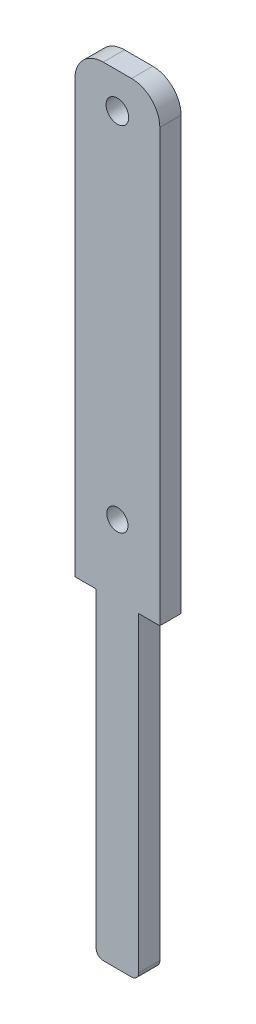
ISO-10303-21;
HEADER;
FILE_DESCRIPTION(('STEP AP214'),'2;1');
FILE_NAME('part.step','',(''),(''),'','','');
FILE_SCHEMA(('AUTOMOTIVE_DESIGN { 1 0 10303 214 1 1 1 1 }'));
ENDSEC;
DATA;
#1=APPLICATION_CONTEXT('core data for automotive mechanical design processes');
#2=APPLICATION_PROTOCOL_DEFINITION('international standard','automotive_design',2000,#1);
#3=PRODUCT_CONTEXT('',#1,'mechanical');
#4=PRODUCT('Part','Part','',(#3));
#5=PRODUCT_RELATED_PRODUCT_CATEGORY('part','',(#4));
#6=PRODUCT_DEFINITION_FORMATION('','',#4);
#7=PRODUCT_DEFINITION_CONTEXT('part definition',#1,'design');
#8=PRODUCT_DEFINITION('design','',#6,#7);
#9=PRODUCT_DEFINITION_SHAPE('','',#8);
#10=(LENGTH_UNIT() NAMED_UNIT(*) SI_UNIT(.MILLI.,.METRE.));
#11=(NAMED_UNIT(*) PLANE_ANGLE_UNIT() SI_UNIT($,.RADIAN.));
#12=(NAMED_UNIT(*) SI_UNIT($,.STERADIAN.) SOLID_ANGLE_UNIT());
#13=UNCERTAINTY_MEASURE_WITH_UNIT(LENGTH_MEASURE(1.E-05),#10,'distance_accuracy_value','');
#14=(GEOMETRIC_REPRESENTATION_CONTEXT(3) GLOBAL_UNCERTAINTY_ASSIGNED_CONTEXT((#13)) GLOBAL_UNIT_ASSIGNED_CONTEXT((#10,
#11,#12)) REPRESENTATION_CONTEXT('',''));
#15=CARTESIAN_POINT('',(0.,0.,0.));
#16=DIRECTION('',(0.,0.,1.));
#17=DIRECTION('',(1.,0.,0.));
#18=AXIS2_PLACEMENT_3D('',#15,#16,#17);
#19=CARTESIAN_POINT('',(-2.,51.,1.5));
#20=DIRECTION('',(0.,0.,-1.));
#21=DIRECTION('',(-1.,0.,0.));
#22=AXIS2_PLACEMENT_3D('',#19,#20,#21);
#23=CYLINDRICAL_SURFACE('',#22,4.);
#24=CARTESIAN_POINT('',(-2.,51.,-1.5));
#25=DIRECTION('',(0.,0.,1.));
#26=DIRECTION('',(1.,0.,0.));
#27=AXIS2_PLACEMENT_3D('',#24,#25,#26);
#28=CIRCLE('',#27,4.);
#29=CARTESIAN_POINT('',(-6.,51.,-1.5));
#30=VERTEX_POINT('',#29);
#31=CARTESIAN_POINT('',(-2.,55.,-1.5));
#32=VERTEX_POINT('',#31);
#33=EDGE_CURVE('E135',#30,#32,#28,.F.);
#34=ORIENTED_EDGE('',*,*,#33,.F.);
#35=DIRECTION('',(0.,0.,-1.));
#36=VECTOR('',#35,1.);
#37=CARTESIAN_POINT('',(-6.,51.,1.5));
#38=LINE('',#37,#36);
#39=CARTESIAN_POINT('',(-6.,51.,1.5));
#40=VERTEX_POINT('',#39);
#41=EDGE_CURVE('E130',#40,#30,#38,.T.);
#42=ORIENTED_EDGE('',*,*,#41,.F.);
#43=CARTESIAN_POINT('',(-2.,51.,1.5));
#44=DIRECTION('',(0.,0.,1.));
#45=DIRECTION('',(1.,0.,0.));
#46=AXIS2_PLACEMENT_3D('',#43,#44,#45);
#47=CIRCLE('',#46,4.);
#48=CARTESIAN_POINT('',(-2.,55.,1.5));
#49=VERTEX_POINT('',#48);
#50=EDGE_CURVE('E132',#40,#49,#47,.F.);
#51=ORIENTED_EDGE('',*,*,#50,.T.);
#52=DIRECTION('',(0.,0.,-1.));
#53=VECTOR('',#52,1.);
#54=CARTESIAN_POINT('',(-2.,55.,1.5));
#55=LINE('',#54,#53);
#56=EDGE_CURVE('E173',#49,#32,#55,.T.);
#57=ORIENTED_EDGE('',*,*,#56,.T.);
#58=EDGE_LOOP('',(#34,#42,#51,#57));
#59=FACE_BOUND('',#58,.T.);
#60=ADVANCED_FACE('F38',(#59),#23,.T.);
#61=CARTESIAN_POINT('',(-6.,0.,1.5));
#62=DIRECTION('',(-1.,0.,0.));
#63=DIRECTION('',(0.,-1.,0.));
#64=AXIS2_PLACEMENT_3D('',#61,#62,#63);
#65=PLANE('',#64);
#66=DIRECTION('',(0.,1.,0.));
#67=VECTOR('',#66,1.);
#68=CARTESIAN_POINT('',(-6.,0.,-1.5));
#69=LINE('',#68,#67);
#70=CARTESIAN_POINT('',(-6.,-10.,-1.5));
#71=VERTEX_POINT('',#70);
#72=EDGE_CURVE('E175',#71,#30,#69,.T.);
#73=ORIENTED_EDGE('',*,*,#72,.F.);
#74=DIRECTION('',(0.,0.,-1.));
#75=VECTOR('',#74,1.);
#76=CARTESIAN_POINT('',(-6.,-10.,1.5));
#77=LINE('',#76,#75);
#78=CARTESIAN_POINT('',(-6.,-10.,1.5));
#79=VERTEX_POINT('',#78);
#80=EDGE_CURVE('E141',#79,#71,#77,.T.);
#81=ORIENTED_EDGE('',*,*,#80,.F.);
#82=DIRECTION('',(0.,1.,0.));
#83=VECTOR('',#82,1.);
#84=CARTESIAN_POINT('',(-6.,0.,1.5));
#85=LINE('',#84,#83);
#86=EDGE_CURVE('E146',#79,#40,#85,.T.);
#87=ORIENTED_EDGE('',*,*,#86,.T.);
#88=ORIENTED_EDGE('',*,*,#41,.T.);
#89=EDGE_LOOP('',(#73,#81,#87,#88));
#90=FACE_BOUND('',#89,.T.);
#91=ADVANCED_FACE('F152',(#90),#65,.T.);
#92=CARTESIAN_POINT('',(0.,-10.,1.5));
#93=DIRECTION('',(0.,1.,0.));
#94=DIRECTION('',(0.,0.,1.));
#95=AXIS2_PLACEMENT_3D('',#92,#93,#94);
#96=PLANE('',#95);
#97=DIRECTION('',(1.,0.,0.));
#98=VECTOR('',#97,1.);
#99=CARTESIAN_POINT('',(0.,-10.,-1.5));
#100=LINE('',#99,#98);
#101=CARTESIAN_POINT('',(-3.,-10.,-1.5));
#102=VERTEX_POINT('',#101);
#103=EDGE_CURVE('E178',#71,#102,#100,.T.);
#104=ORIENTED_EDGE('',*,*,#103,.T.);
#105=DIRECTION('',(0.,0.,-1.));
#106=VECTOR('',#105,1.);
#107=CARTESIAN_POINT('',(-3.,-10.,1.5));
#108=LINE('',#107,#106);
#109=CARTESIAN_POINT('',(-3.,-10.,1.5));
#110=VERTEX_POINT('',#109);
#111=EDGE_CURVE('E207',#110,#102,#108,.T.);
#112=ORIENTED_EDGE('',*,*,#111,.F.);
#113=DIRECTION('',(1.,0.,0.));
#114=VECTOR('',#113,1.);
#115=CARTESIAN_POINT('',(0.,-10.,1.5));
#116=LINE('',#115,#114);
#117=EDGE_CURVE('E154',#79,#110,#116,.T.);
#118=ORIENTED_EDGE('',*,*,#117,.F.);
#119=ORIENTED_EDGE('',*,*,#80,.T.);
#120=EDGE_LOOP('',(#104,#112,#118,#119));
#121=FACE_BOUND('',#120,.T.);
#122=ADVANCED_FACE('F246',(#121),#96,.F.);
#123=CARTESIAN_POINT('',(-3.00000000000001,0.,1.5));
#124=DIRECTION('',(1.,0.,0.));
#125=DIRECTION('',(0.,1.,0.));
#126=AXIS2_PLACEMENT_3D('',#123,#124,#125);
#127=PLANE('',#126);
#128=DIRECTION('',(0.,-1.,0.));
#129=VECTOR('',#128,1.);
#130=CARTESIAN_POINT('',(-3.00000000000001,0.,-1.5));
#131=LINE('',#130,#129);
#132=CARTESIAN_POINT('',(-2.99999999999999,-54.,-1.5));
#133=VERTEX_POINT('',#132);
#134=EDGE_CURVE('E180',#102,#133,#131,.T.);
#135=ORIENTED_EDGE('',*,*,#134,.T.);
#136=DIRECTION('',(0.,0.,-1.));
#137=VECTOR('',#136,1.);
#138=CARTESIAN_POINT('',(-2.99999999999999,-54.,1.5));
#139=LINE('',#138,#137);
#140=CARTESIAN_POINT('',(-2.99999999999999,-54.,1.5));
#141=VERTEX_POINT('',#140);
#142=EDGE_CURVE('E11',#133,#141,#139,.F.);
#143=ORIENTED_EDGE('',*,*,#142,.T.);
#144=DIRECTION('',(0.,-1.,0.));
#145=VECTOR('',#144,1.);
#146=CARTESIAN_POINT('',(-3.00000000000001,0.,1.5));
#147=LINE('',#146,#145);
#148=EDGE_CURVE('E156',#110,#141,#147,.T.);
#149=ORIENTED_EDGE('',*,*,#148,.F.);
#150=ORIENTED_EDGE('',*,*,#111,.T.);
#151=EDGE_LOOP('',(#135,#143,#149,#150));
#152=FACE_BOUND('',#151,.T.);
#153=ADVANCED_FACE('F243',(#152),#127,.F.);
#154=CARTESIAN_POINT('',(0.,-55.,1.5));
#155=DIRECTION('',(0.,1.,0.));
#156=DIRECTION('',(0.,0.,1.));
#157=AXIS2_PLACEMENT_3D('',#154,#155,#156);
#158=PLANE('',#157);
#159=DIRECTION('',(1.,0.,0.));
#160=VECTOR('',#159,1.);
#161=CARTESIAN_POINT('',(0.,-55.,-1.5));
#162=LINE('',#161,#160);
#163=CARTESIAN_POINT('',(-1.99999999999999,-55.,-1.5));
#164=VERTEX_POINT('',#163);
#165=CARTESIAN_POINT('',(2.00000000000001,-55.,-1.5));
#166=VERTEX_POINT('',#165);
#167=EDGE_CURVE('E182',#164,#166,#162,.T.);
#168=ORIENTED_EDGE('',*,*,#167,.T.);
#169=DIRECTION('',(0.,0.,-1.));
#170=VECTOR('',#169,1.);
#171=CARTESIAN_POINT('',(2.00000000000001,-55.,1.5));
#172=LINE('',#171,#170);
#173=CARTESIAN_POINT('',(2.00000000000001,-55.,1.5));
#174=VERTEX_POINT('',#173);
#175=EDGE_CURVE('E60',#166,#174,#172,.F.);
#176=ORIENTED_EDGE('',*,*,#175,.T.);
#177=DIRECTION('',(1.,0.,0.));
#178=VECTOR('',#177,1.);
#179=CARTESIAN_POINT('',(0.,-55.,1.5));
#180=LINE('',#179,#178);
#181=CARTESIAN_POINT('',(-1.99999999999999,-55.,1.5));
#182=VERTEX_POINT('',#181);
#183=EDGE_CURVE('E161',#182,#174,#180,.T.);
#184=ORIENTED_EDGE('',*,*,#183,.F.);
#185=DIRECTION('',(0.,0.,-1.));
#186=VECTOR('',#185,1.);
#187=CARTESIAN_POINT('',(-1.99999999999999,-55.,1.5));
#188=LINE('',#187,#186);
#189=EDGE_CURVE('E217',#182,#164,#188,.T.);
#190=ORIENTED_EDGE('',*,*,#189,.T.);
#191=EDGE_LOOP('',(#168,#176,#184,#190));
#192=FACE_BOUND('',#191,.T.);
#193=ADVANCED_FACE('F237',(#192),#158,.F.);
#194=CARTESIAN_POINT('',(3.00000000000001,0.,1.5));
#195=DIRECTION('',(-1.,0.,0.));
#196=DIRECTION('',(0.,-1.,0.));
#197=AXIS2_PLACEMENT_3D('',#194,#195,#196);
#198=PLANE('',#197);
#199=DIRECTION('',(0.,1.,0.));
#200=VECTOR('',#199,1.);
#201=CARTESIAN_POINT('',(3.00000000000001,0.,1.5));
#202=LINE('',#201,#200);
#203=CARTESIAN_POINT('',(3.00000000000001,-54.,1.5));
#204=VERTEX_POINT('',#203);
#205=CARTESIAN_POINT('',(3.00000000000001,-10.,1.5));
#206=VERTEX_POINT('',#205);
#207=EDGE_CURVE('E163',#204,#206,#202,.T.);
#208=ORIENTED_EDGE('',*,*,#207,.F.);
#209=DIRECTION('',(0.,0.,-1.));
#210=VECTOR('',#209,1.);
#211=CARTESIAN_POINT('',(3.00000000000001,-54.,1.5));
#212=LINE('',#211,#210);
#213=CARTESIAN_POINT('',(3.00000000000001,-54.,-1.5));
#214=VERTEX_POINT('',#213);
#215=EDGE_CURVE('E140',#204,#214,#212,.T.);
#216=ORIENTED_EDGE('',*,*,#215,.T.);
#217=DIRECTION('',(0.,1.,0.));
#218=VECTOR('',#217,1.);
#219=CARTESIAN_POINT('',(3.00000000000001,0.,-1.5));
#220=LINE('',#219,#218);
#221=CARTESIAN_POINT('',(3.00000000000001,-10.,-1.5));
#222=VERTEX_POINT('',#221);
#223=EDGE_CURVE('E184',#214,#222,#220,.T.);
#224=ORIENTED_EDGE('',*,*,#223,.T.);
#225=DIRECTION('',(0.,0.,-1.));
#226=VECTOR('',#225,1.);
#227=CARTESIAN_POINT('',(3.00000000000001,-10.,1.5));
#228=LINE('',#227,#226);
#229=EDGE_CURVE('E204',#206,#222,#228,.T.);
#230=ORIENTED_EDGE('',*,*,#229,.F.);
#231=EDGE_LOOP('',(#208,#216,#224,#230));
#232=FACE_BOUND('',#231,.T.);
#233=ADVANCED_FACE('F229',(#232),#198,.F.);
#234=CARTESIAN_POINT('',(0.,-10.,1.5));
#235=DIRECTION('',(0.,1.,0.));
#236=DIRECTION('',(0.,0.,1.));
#237=AXIS2_PLACEMENT_3D('',#234,#235,#236);
#238=PLANE('',#237);
#239=DIRECTION('',(1.,0.,0.));
#240=VECTOR('',#239,1.);
#241=CARTESIAN_POINT('',(0.,-10.,-1.5));
#242=LINE('',#241,#240);
#243=CARTESIAN_POINT('',(6.,-10.,-1.5));
#244=VERTEX_POINT('',#243);
#245=EDGE_CURVE('E186',#222,#244,#242,.T.);
#246=ORIENTED_EDGE('',*,*,#245,.T.);
#247=DIRECTION('',(0.,0.,-1.));
#248=VECTOR('',#247,1.);
#249=CARTESIAN_POINT('',(6.,-10.,1.5));
#250=LINE('',#249,#248);
#251=CARTESIAN_POINT('',(6.,-10.,1.5));
#252=VERTEX_POINT('',#251);
#253=EDGE_CURVE('E201',#252,#244,#250,.T.);
#254=ORIENTED_EDGE('',*,*,#253,.F.);
#255=DIRECTION('',(1.,0.,0.));
#256=VECTOR('',#255,1.);
#257=CARTESIAN_POINT('',(0.,-10.,1.5));
#258=LINE('',#257,#256);
#259=EDGE_CURVE('E165',#206,#252,#258,.T.);
#260=ORIENTED_EDGE('',*,*,#259,.F.);
#261=ORIENTED_EDGE('',*,*,#229,.T.);
#262=EDGE_LOOP('',(#246,#254,#260,#261));
#263=FACE_BOUND('',#262,.T.);
#264=ADVANCED_FACE('F260',(#263),#238,.F.);
#265=CARTESIAN_POINT('',(6.,0.,1.5));
#266=DIRECTION('',(-1.,0.,0.));
#267=DIRECTION('',(0.,-1.,0.));
#268=AXIS2_PLACEMENT_3D('',#265,#266,#267);
#269=PLANE('',#268);
#270=DIRECTION('',(0.,1.,0.));
#271=VECTOR('',#270,1.);
#272=CARTESIAN_POINT('',(6.,0.,-1.5));
#273=LINE('',#272,#271);
#274=CARTESIAN_POINT('',(6.,51.,-1.5));
#275=VERTEX_POINT('',#274);
#276=EDGE_CURVE('E188',#244,#275,#273,.T.);
#277=ORIENTED_EDGE('',*,*,#276,.T.);
#278=DIRECTION('',(0.,0.,-1.));
#279=VECTOR('',#278,1.);
#280=CARTESIAN_POINT('',(6.,51.,1.5));
#281=LINE('',#280,#279);
#282=CARTESIAN_POINT('',(6.,51.,1.5));
#283=VERTEX_POINT('',#282);
#284=EDGE_CURVE('E199',#283,#275,#281,.T.);
#285=ORIENTED_EDGE('',*,*,#284,.F.);
#286=DIRECTION('',(0.,1.,0.));
#287=VECTOR('',#286,1.);
#288=CARTESIAN_POINT('',(6.,0.,1.5));
#289=LINE('',#288,#287);
#290=EDGE_CURVE('E167',#252,#283,#289,.T.);
#291=ORIENTED_EDGE('',*,*,#290,.F.);
#292=ORIENTED_EDGE('',*,*,#253,.T.);
#293=EDGE_LOOP('',(#277,#285,#291,#292));
#294=FACE_BOUND('',#293,.T.);
#295=ADVANCED_FACE('F256',(#294),#269,.F.);
#296=CARTESIAN_POINT('',(2.,51.,1.5));
#297=DIRECTION('',(0.,0.,-1.));
#298=DIRECTION('',(-1.,0.,0.));
#299=AXIS2_PLACEMENT_3D('',#296,#297,#298);
#300=CYLINDRICAL_SURFACE('',#299,4.);
#301=CARTESIAN_POINT('',(2.,51.,-1.5));
#302=DIRECTION('',(0.,0.,1.));
#303=DIRECTION('',(1.,0.,0.));
#304=AXIS2_PLACEMENT_3D('',#301,#302,#303);
#305=CIRCLE('',#304,4.);
#306=CARTESIAN_POINT('',(2.,55.,-1.5));
#307=VERTEX_POINT('',#306);
#308=EDGE_CURVE('E191',#307,#275,#305,.F.);
#309=ORIENTED_EDGE('',*,*,#308,.F.);
#310=DIRECTION('',(0.,0.,-1.));
#311=VECTOR('',#310,1.);
#312=CARTESIAN_POINT('',(2.,55.,1.5));
#313=LINE('',#312,#311);
#314=CARTESIAN_POINT('',(2.,55.,1.5));
#315=VERTEX_POINT('',#314);
#316=EDGE_CURVE('E197',#315,#307,#313,.T.);
#317=ORIENTED_EDGE('',*,*,#316,.F.);
#318=CARTESIAN_POINT('',(2.,51.,1.5));
#319=DIRECTION('',(0.,0.,1.));
#320=DIRECTION('',(1.,0.,0.));
#321=AXIS2_PLACEMENT_3D('',#318,#319,#320);
#322=CIRCLE('',#321,4.);
#323=EDGE_CURVE('E169',#315,#283,#322,.F.);
#324=ORIENTED_EDGE('',*,*,#323,.T.);
#325=ORIENTED_EDGE('',*,*,#284,.T.);
#326=EDGE_LOOP('',(#309,#317,#324,#325));
#327=FACE_BOUND('',#326,.T.);
#328=ADVANCED_FACE('F252',(#327),#300,.T.);
#329=CARTESIAN_POINT('',(0.,55.,1.5));
#330=DIRECTION('',(0.,1.,0.));
#331=DIRECTION('',(0.,0.,1.));
#332=AXIS2_PLACEMENT_3D('',#329,#330,#331);
#333=PLANE('',#332);
#334=DIRECTION('',(1.,0.,0.));
#335=VECTOR('',#334,1.);
#336=CARTESIAN_POINT('',(0.,55.,-1.5));
#337=LINE('',#336,#335);
#338=EDGE_CURVE('E150',#32,#307,#337,.T.);
#339=ORIENTED_EDGE('',*,*,#338,.F.);
#340=ORIENTED_EDGE('',*,*,#56,.F.);
#341=DIRECTION('',(1.,0.,0.));
#342=VECTOR('',#341,1.);
#343=CARTESIAN_POINT('',(0.,55.,1.5));
#344=LINE('',#343,#342);
#345=EDGE_CURVE('E149',#49,#315,#344,.T.);
#346=ORIENTED_EDGE('',*,*,#345,.T.);
#347=ORIENTED_EDGE('',*,*,#316,.T.);
#348=EDGE_LOOP('',(#339,#340,#346,#347));
#349=FACE_BOUND('',#348,.T.);
#350=ADVANCED_FACE('F249',(#349),#333,.T.);
#351=CARTESIAN_POINT('',(0.,0.,1.5));
#352=DIRECTION('',(0.,0.,1.));
#353=DIRECTION('',(1.,0.,0.));
#354=AXIS2_PLACEMENT_3D('',#351,#352,#353);
#355=PLANE('',#354);
#356=CARTESIAN_POINT('',(0.,0.,1.5));
#357=DIRECTION('',(0.,0.,1.));
#358=DIRECTION('',(1.,0.,0.));
#359=AXIS2_PLACEMENT_3D('',#356,#357,#358);
#360=CIRCLE('',#359,1.5);
#361=CARTESIAN_POINT('',(1.5,0.,1.5));
#362=VERTEX_POINT('',#361);
#363=EDGE_CURVE('E401',#362,#362,#360,.T.);
#364=ORIENTED_EDGE('',*,*,#363,.F.);
#365=EDGE_LOOP('',(#364));
#366=FACE_BOUND('',#365,.T.);
#367=CARTESIAN_POINT('',(0.,50.,1.5));
#368=DIRECTION('',(0.,0.,1.));
#369=DIRECTION('',(1.,0.,0.));
#370=AXIS2_PLACEMENT_3D('',#367,#368,#369);
#371=CIRCLE('',#370,1.6);
#372=CARTESIAN_POINT('',(1.6,50.,1.5));
#373=VERTEX_POINT('',#372);
#374=EDGE_CURVE('E404',#373,#373,#371,.T.);
#375=ORIENTED_EDGE('',*,*,#374,.F.);
#376=EDGE_LOOP('',(#375));
#377=FACE_BOUND('',#376,.T.);
#378=ORIENTED_EDGE('',*,*,#183,.T.);
#379=CARTESIAN_POINT('',(2.00000000000001,-54.,1.5));
#380=DIRECTION('',(0.,0.,1.));
#381=DIRECTION('',(1.,0.,0.));
#382=AXIS2_PLACEMENT_3D('',#379,#380,#381);
#383=CIRCLE('',#382,1.);
#384=EDGE_CURVE('E47',#174,#204,#383,.T.);
#385=ORIENTED_EDGE('',*,*,#384,.T.);
#386=ORIENTED_EDGE('',*,*,#207,.T.);
#387=ORIENTED_EDGE('',*,*,#259,.T.);
#388=ORIENTED_EDGE('',*,*,#290,.T.);
#389=ORIENTED_EDGE('',*,*,#323,.F.);
#390=ORIENTED_EDGE('',*,*,#345,.F.);
#391=ORIENTED_EDGE('',*,*,#50,.F.);
#392=ORIENTED_EDGE('',*,*,#86,.F.);
#393=ORIENTED_EDGE('',*,*,#117,.T.);
#394=ORIENTED_EDGE('',*,*,#148,.T.);
#395=CARTESIAN_POINT('',(-1.99999999999999,-54.,1.5));
#396=DIRECTION('',(0.,0.,1.));
#397=DIRECTION('',(1.,0.,0.));
#398=AXIS2_PLACEMENT_3D('',#395,#396,#397);
#399=CIRCLE('',#398,1.);
#400=EDGE_CURVE('E221',#141,#182,#399,.T.);
#401=ORIENTED_EDGE('',*,*,#400,.T.);
#402=EDGE_LOOP('',(#378,#385,#386,#387,#388,#389,#390,#391,#392,#393,#394,#401));
#403=FACE_BOUND('',#402,.T.);
#404=ADVANCED_FACE('F145',(#366,#377,#403),#355,.T.);
#405=CARTESIAN_POINT('',(0.,0.,-1.5));
#406=DIRECTION('',(0.,0.,1.));
#407=DIRECTION('',(1.,0.,0.));
#408=AXIS2_PLACEMENT_3D('',#405,#406,#407);
#409=PLANE('',#408);
#410=CARTESIAN_POINT('',(0.,0.,-1.5));
#411=DIRECTION('',(0.,0.,1.));
#412=DIRECTION('',(1.,0.,0.));
#413=AXIS2_PLACEMENT_3D('',#410,#411,#412);
#414=CIRCLE('',#413,1.5);
#415=CARTESIAN_POINT('',(1.5,0.,-1.5));
#416=VERTEX_POINT('',#415);
#417=EDGE_CURVE('E42',#416,#416,#414,.T.);
#418=ORIENTED_EDGE('',*,*,#417,.T.);
#419=EDGE_LOOP('',(#418));
#420=FACE_BOUND('',#419,.T.);
#421=CARTESIAN_POINT('',(0.,50.,-1.5));
#422=DIRECTION('',(0.,0.,1.));
#423=DIRECTION('',(1.,0.,0.));
#424=AXIS2_PLACEMENT_3D('',#421,#422,#423);
#425=CIRCLE('',#424,1.6);
#426=CARTESIAN_POINT('',(1.6,50.,-1.5));
#427=VERTEX_POINT('',#426);
#428=EDGE_CURVE('E176',#427,#427,#425,.T.);
#429=ORIENTED_EDGE('',*,*,#428,.T.);
#430=EDGE_LOOP('',(#429));
#431=FACE_BOUND('',#430,.T.);
#432=ORIENTED_EDGE('',*,*,#223,.F.);
#433=CARTESIAN_POINT('',(2.00000000000001,-54.,-1.5));
#434=DIRECTION('',(0.,0.,1.));
#435=DIRECTION('',(1.,0.,0.));
#436=AXIS2_PLACEMENT_3D('',#433,#434,#435);
#437=CIRCLE('',#436,1.);
#438=EDGE_CURVE('E215',#214,#166,#437,.F.);
#439=ORIENTED_EDGE('',*,*,#438,.T.);
#440=ORIENTED_EDGE('',*,*,#167,.F.);
#441=CARTESIAN_POINT('',(-1.99999999999999,-54.,-1.5));
#442=DIRECTION('',(0.,0.,1.));
#443=DIRECTION('',(1.,0.,0.));
#444=AXIS2_PLACEMENT_3D('',#441,#442,#443);
#445=CIRCLE('',#444,1.);
#446=EDGE_CURVE('E213',#164,#133,#445,.F.);
#447=ORIENTED_EDGE('',*,*,#446,.T.);
#448=ORIENTED_EDGE('',*,*,#134,.F.);
#449=ORIENTED_EDGE('',*,*,#103,.F.);
#450=ORIENTED_EDGE('',*,*,#72,.T.);
#451=ORIENTED_EDGE('',*,*,#33,.T.);
#452=ORIENTED_EDGE('',*,*,#338,.T.);
#453=ORIENTED_EDGE('',*,*,#308,.T.);
#454=ORIENTED_EDGE('',*,*,#276,.F.);
#455=ORIENTED_EDGE('',*,*,#245,.F.);
#456=EDGE_LOOP('',(#432,#439,#440,#447,#448,#449,#450,#451,#452,#453,#454,#455));
#457=FACE_BOUND('',#456,.T.);
#458=ADVANCED_FACE('F235',(#420,#431,#457),#409,.F.);
#459=CARTESIAN_POINT('',(0.,50.,-1.5));
#460=DIRECTION('',(0.,0.,1.));
#461=DIRECTION('',(1.,0.,0.));
#462=AXIS2_PLACEMENT_3D('',#459,#460,#461);
#463=CYLINDRICAL_SURFACE('',#462,1.6);
#464=ORIENTED_EDGE('',*,*,#428,.F.);
#465=EDGE_LOOP('',(#464));
#466=FACE_BOUND('',#465,.T.);
#467=ORIENTED_EDGE('',*,*,#374,.T.);
#468=EDGE_LOOP('',(#467));
#469=FACE_BOUND('',#468,.T.);
#470=ADVANCED_FACE('F277',(#466,#469),#463,.F.);
#471=CARTESIAN_POINT('',(2.00000000000001,-54.,1.5));
#472=DIRECTION('',(0.,0.,-1.));
#473=DIRECTION('',(-1.,0.,0.));
#474=AXIS2_PLACEMENT_3D('',#471,#472,#473);
#475=CYLINDRICAL_SURFACE('',#474,1.);
#476=ORIENTED_EDGE('',*,*,#384,.F.);
#477=ORIENTED_EDGE('',*,*,#175,.F.);
#478=ORIENTED_EDGE('',*,*,#438,.F.);
#479=ORIENTED_EDGE('',*,*,#215,.F.);
#480=EDGE_LOOP('',(#476,#477,#478,#479));
#481=FACE_BOUND('',#480,.T.);
#482=ADVANCED_FACE('F232',(#481),#475,.T.);
#483=CARTESIAN_POINT('',(-1.99999999999999,-54.,1.5));
#484=DIRECTION('',(0.,0.,-1.));
#485=DIRECTION('',(-1.,0.,0.));
#486=AXIS2_PLACEMENT_3D('',#483,#484,#485);
#487=CYLINDRICAL_SURFACE('',#486,1.);
#488=ORIENTED_EDGE('',*,*,#400,.F.);
#489=ORIENTED_EDGE('',*,*,#142,.F.);
#490=ORIENTED_EDGE('',*,*,#446,.F.);
#491=ORIENTED_EDGE('',*,*,#189,.F.);
#492=EDGE_LOOP('',(#488,#489,#490,#491));
#493=FACE_BOUND('',#492,.T.);
#494=ADVANCED_FACE('F40',(#493),#487,.T.);
#495=CARTESIAN_POINT('',(0.,0.,-5.));
#496=DIRECTION('',(0.,0.,1.));
#497=DIRECTION('',(1.,0.,0.));
#498=AXIS2_PLACEMENT_3D('',#495,#496,#497);
#499=CYLINDRICAL_SURFACE('',#498,1.5);
#500=ORIENTED_EDGE('',*,*,#363,.T.);
#501=EDGE_LOOP('',(#500));
#502=FACE_BOUND('',#501,.T.);
#503=ORIENTED_EDGE('',*,*,#417,.F.);
#504=EDGE_LOOP('',(#503));
#505=FACE_BOUND('',#504,.T.);
#506=ADVANCED_FACE('F282',(#502,#505),#499,.F.);
#507=CLOSED_SHELL('',(#60,#91,#122,#153,#193,#233,#264,#295,#328,#350,#404,#458,#470,#482,#494,#506));
#508=MANIFOLD_SOLID_BREP('B2',#507);
#509=ADVANCED_BREP_SHAPE_REPRESENTATION('',(#18,#508),#14);
#510=SHAPE_DEFINITION_REPRESENTATION(#9,#509);
ENDSEC;
END-ISO-10303-21;
